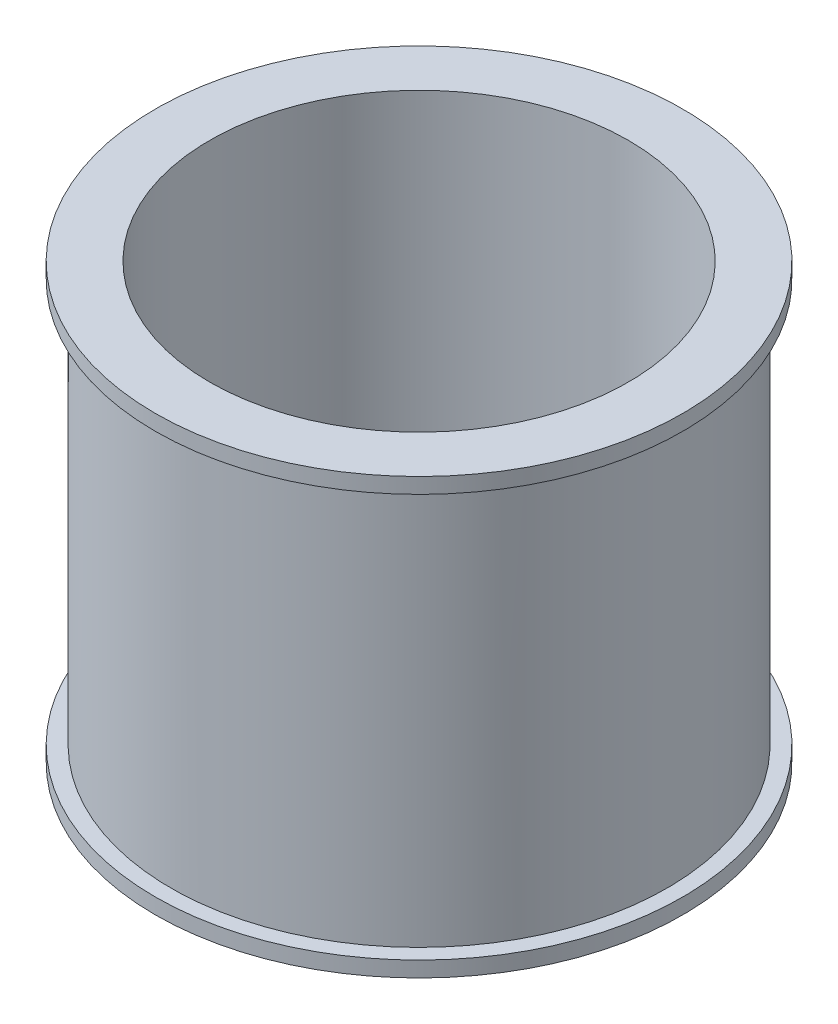
ISO-10303-21;
HEADER;
FILE_DESCRIPTION(('STEP AP214'),'2;1');
FILE_NAME('part.step','',(''),(''),'','','');
FILE_SCHEMA(('AUTOMOTIVE_DESIGN { 1 0 10303 214 1 1 1 1 }'));
ENDSEC;
DATA;
#1=APPLICATION_CONTEXT('core data for automotive mechanical design processes');
#2=APPLICATION_PROTOCOL_DEFINITION('international standard','automotive_design',2000,#1);
#3=PRODUCT_CONTEXT('',#1,'mechanical');
#4=PRODUCT('Part','Part','',(#3));
#5=PRODUCT_RELATED_PRODUCT_CATEGORY('part','',(#4));
#6=PRODUCT_DEFINITION_FORMATION('','',#4);
#7=PRODUCT_DEFINITION_CONTEXT('part definition',#1,'design');
#8=PRODUCT_DEFINITION('design','',#6,#7);
#9=PRODUCT_DEFINITION_SHAPE('','',#8);
#10=(LENGTH_UNIT() NAMED_UNIT(*) SI_UNIT(.MILLI.,.METRE.));
#11=(NAMED_UNIT(*) PLANE_ANGLE_UNIT() SI_UNIT($,.RADIAN.));
#12=(NAMED_UNIT(*) SI_UNIT($,.STERADIAN.) SOLID_ANGLE_UNIT());
#13=UNCERTAINTY_MEASURE_WITH_UNIT(LENGTH_MEASURE(1.E-05),#10,'distance_accuracy_value','');
#14=(GEOMETRIC_REPRESENTATION_CONTEXT(3) GLOBAL_UNCERTAINTY_ASSIGNED_CONTEXT((#13)) GLOBAL_UNIT_ASSIGNED_CONTEXT((#10,
#11,#12)) REPRESENTATION_CONTEXT('',''));
#15=CARTESIAN_POINT('',(0.,0.,0.));
#16=DIRECTION('',(0.,0.,1.));
#17=DIRECTION('',(1.,0.,0.));
#18=AXIS2_PLACEMENT_3D('',#15,#16,#17);
#19=CARTESIAN_POINT('',(0.,7.,0.));
#20=DIRECTION('',(0.,-1.,0.));
#21=DIRECTION('',(0.,0.,-1.));
#22=AXIS2_PLACEMENT_3D('',#19,#20,#21);
#23=CYLINDRICAL_SURFACE('',#22,4.);
#24=CARTESIAN_POINT('',(0.,6.75,0.));
#25=DIRECTION('',(0.,1.,0.));
#26=DIRECTION('',(0.,0.,1.));
#27=AXIS2_PLACEMENT_3D('',#24,#25,#26);
#28=CIRCLE('',#27,4.);
#29=CARTESIAN_POINT('',(0.,6.75,4.));
#30=VERTEX_POINT('',#29);
#31=EDGE_CURVE('E41',#30,#30,#28,.T.);
#32=ORIENTED_EDGE('',*,*,#31,.F.);
#33=EDGE_LOOP('',(#32));
#34=FACE_BOUND('',#33,.T.);
#35=CARTESIAN_POINT('',(0.,0.25,0.));
#36=DIRECTION('',(0.,-1.,0.));
#37=DIRECTION('',(0.,0.,-1.));
#38=AXIS2_PLACEMENT_3D('',#35,#36,#37);
#39=CIRCLE('',#38,4.);
#40=CARTESIAN_POINT('',(0.,0.25,-4.));
#41=VERTEX_POINT('',#40);
#42=EDGE_CURVE('E10',#41,#41,#39,.T.);
#43=ORIENTED_EDGE('',*,*,#42,.F.);
#44=EDGE_LOOP('',(#43));
#45=FACE_BOUND('',#44,.T.);
#46=ADVANCED_FACE('F35',(#34,#45),#23,.T.);
#47=CARTESIAN_POINT('',(0.,7.,0.));
#48=DIRECTION('',(0.,1.,0.));
#49=DIRECTION('',(0.,0.,1.));
#50=AXIS2_PLACEMENT_3D('',#47,#48,#49);
#51=PLANE('',#50);
#52=CARTESIAN_POINT('',(0.,7.,0.));
#53=DIRECTION('',(0.,1.,0.));
#54=DIRECTION('',(0.,0.,1.));
#55=AXIS2_PLACEMENT_3D('',#52,#53,#54);
#56=CIRCLE('',#55,3.375);
#57=CARTESIAN_POINT('',(0.,7.,3.375));
#58=VERTEX_POINT('',#57);
#59=EDGE_CURVE('E49',#58,#58,#56,.T.);
#60=ORIENTED_EDGE('',*,*,#59,.F.);
#61=EDGE_LOOP('',(#60));
#62=FACE_BOUND('',#61,.T.);
#63=CARTESIAN_POINT('',(0.,7.,0.));
#64=DIRECTION('',(0.,1.,0.));
#65=DIRECTION('',(0.,0.,1.));
#66=AXIS2_PLACEMENT_3D('',#63,#64,#65);
#67=CIRCLE('',#66,4.25);
#68=CARTESIAN_POINT('',(0.,7.,4.25));
#69=VERTEX_POINT('',#68);
#70=EDGE_CURVE('E55',#69,#69,#67,.T.);
#71=ORIENTED_EDGE('',*,*,#70,.T.);
#72=EDGE_LOOP('',(#71));
#73=FACE_BOUND('',#72,.T.);
#74=ADVANCED_FACE('F78',(#62,#73),#51,.T.);
#75=CARTESIAN_POINT('',(0.,0.,0.));
#76=DIRECTION('',(0.,1.,0.));
#77=DIRECTION('',(0.,0.,1.));
#78=AXIS2_PLACEMENT_3D('',#75,#76,#77);
#79=PLANE('',#78);
#80=CARTESIAN_POINT('',(0.,0.,0.));
#81=DIRECTION('',(0.,1.,0.));
#82=DIRECTION('',(0.,0.,1.));
#83=AXIS2_PLACEMENT_3D('',#80,#81,#82);
#84=CIRCLE('',#83,3.375);
#85=CARTESIAN_POINT('',(0.,0.,3.375));
#86=VERTEX_POINT('',#85);
#87=EDGE_CURVE('E45',#86,#86,#84,.T.);
#88=ORIENTED_EDGE('',*,*,#87,.T.);
#89=EDGE_LOOP('',(#88));
#90=FACE_BOUND('',#89,.T.);
#91=CARTESIAN_POINT('',(0.,0.,0.));
#92=DIRECTION('',(0.,1.,0.));
#93=DIRECTION('',(0.,0.,1.));
#94=AXIS2_PLACEMENT_3D('',#91,#92,#93);
#95=CIRCLE('',#94,4.25);
#96=CARTESIAN_POINT('',(0.,0.,4.25));
#97=VERTEX_POINT('',#96);
#98=EDGE_CURVE('E61',#97,#97,#95,.T.);
#99=ORIENTED_EDGE('',*,*,#98,.F.);
#100=EDGE_LOOP('',(#99));
#101=FACE_BOUND('',#100,.T.);
#102=ADVANCED_FACE('F75',(#90,#101),#79,.F.);
#103=CARTESIAN_POINT('',(0.,-3.,0.));
#104=DIRECTION('',(0.,1.,0.));
#105=DIRECTION('',(0.,0.,1.));
#106=AXIS2_PLACEMENT_3D('',#103,#104,#105);
#107=CYLINDRICAL_SURFACE('',#106,3.375);
#108=ORIENTED_EDGE('',*,*,#59,.T.);
#109=EDGE_LOOP('',(#108));
#110=FACE_BOUND('',#109,.T.);
#111=ORIENTED_EDGE('',*,*,#87,.F.);
#112=EDGE_LOOP('',(#111));
#113=FACE_BOUND('',#112,.T.);
#114=ADVANCED_FACE('F77',(#110,#113),#107,.F.);
#115=CARTESIAN_POINT('',(0.,6.75,0.));
#116=DIRECTION('',(0.,1.,0.));
#117=DIRECTION('',(0.,0.,1.));
#118=AXIS2_PLACEMENT_3D('',#115,#116,#117);
#119=CYLINDRICAL_SURFACE('',#118,4.25);
#120=CARTESIAN_POINT('',(0.,6.75,0.));
#121=DIRECTION('',(0.,1.,0.));
#122=DIRECTION('',(0.,0.,1.));
#123=AXIS2_PLACEMENT_3D('',#120,#121,#122);
#124=CIRCLE('',#123,4.25);
#125=CARTESIAN_POINT('',(0.,6.75,4.25));
#126=VERTEX_POINT('',#125);
#127=EDGE_CURVE('E54',#126,#126,#124,.T.);
#128=ORIENTED_EDGE('',*,*,#127,.T.);
#129=EDGE_LOOP('',(#128));
#130=FACE_BOUND('',#129,.T.);
#131=ORIENTED_EDGE('',*,*,#70,.F.);
#132=EDGE_LOOP('',(#131));
#133=FACE_BOUND('',#132,.T.);
#134=ADVANCED_FACE('F84',(#130,#133),#119,.T.);
#135=CARTESIAN_POINT('',(0.,6.75,0.));
#136=DIRECTION('',(0.,1.,0.));
#137=DIRECTION('',(0.,0.,1.));
#138=AXIS2_PLACEMENT_3D('',#135,#136,#137);
#139=PLANE('',#138);
#140=ORIENTED_EDGE('',*,*,#31,.T.);
#141=EDGE_LOOP('',(#140));
#142=FACE_BOUND('',#141,.T.);
#143=ORIENTED_EDGE('',*,*,#127,.F.);
#144=EDGE_LOOP('',(#143));
#145=FACE_BOUND('',#144,.T.);
#146=ADVANCED_FACE('F111',(#142,#145),#139,.F.);
#147=CARTESIAN_POINT('',(0.,0.25,0.));
#148=DIRECTION('',(0.,-1.,0.));
#149=DIRECTION('',(0.,0.,1.));
#150=AXIS2_PLACEMENT_3D('',#147,#148,#149);
#151=PLANE('',#150);
#152=CARTESIAN_POINT('',(0.,0.25,0.));
#153=DIRECTION('',(0.,1.,0.));
#154=DIRECTION('',(0.,0.,1.));
#155=AXIS2_PLACEMENT_3D('',#152,#153,#154);
#156=CIRCLE('',#155,4.25);
#157=CARTESIAN_POINT('',(0.,0.25,4.25));
#158=VERTEX_POINT('',#157);
#159=EDGE_CURVE('E58',#158,#158,#156,.T.);
#160=ORIENTED_EDGE('',*,*,#159,.T.);
#161=EDGE_LOOP('',(#160));
#162=FACE_BOUND('',#161,.T.);
#163=ORIENTED_EDGE('',*,*,#42,.T.);
#164=EDGE_LOOP('',(#163));
#165=FACE_BOUND('',#164,.T.);
#166=ADVANCED_FACE('F67',(#162,#165),#151,.F.);
#167=CARTESIAN_POINT('',(0.,0.25,0.));
#168=DIRECTION('',(0.,-1.,0.));
#169=DIRECTION('',(0.,0.,-1.));
#170=AXIS2_PLACEMENT_3D('',#167,#168,#169);
#171=CYLINDRICAL_SURFACE('',#170,4.25);
#172=ORIENTED_EDGE('',*,*,#159,.F.);
#173=EDGE_LOOP('',(#172));
#174=FACE_BOUND('',#173,.T.);
#175=ORIENTED_EDGE('',*,*,#98,.T.);
#176=EDGE_LOOP('',(#175));
#177=FACE_BOUND('',#176,.T.);
#178=ADVANCED_FACE('F69',(#174,#177),#171,.T.);
#179=CLOSED_SHELL('',(#46,#74,#102,#114,#134,#146,#166,#178));
#180=MANIFOLD_SOLID_BREP('B2',#179);
#181=ADVANCED_BREP_SHAPE_REPRESENTATION('',(#18,#180),#14);
#182=SHAPE_DEFINITION_REPRESENTATION(#9,#181);
ENDSEC;
END-ISO-10303-21;
